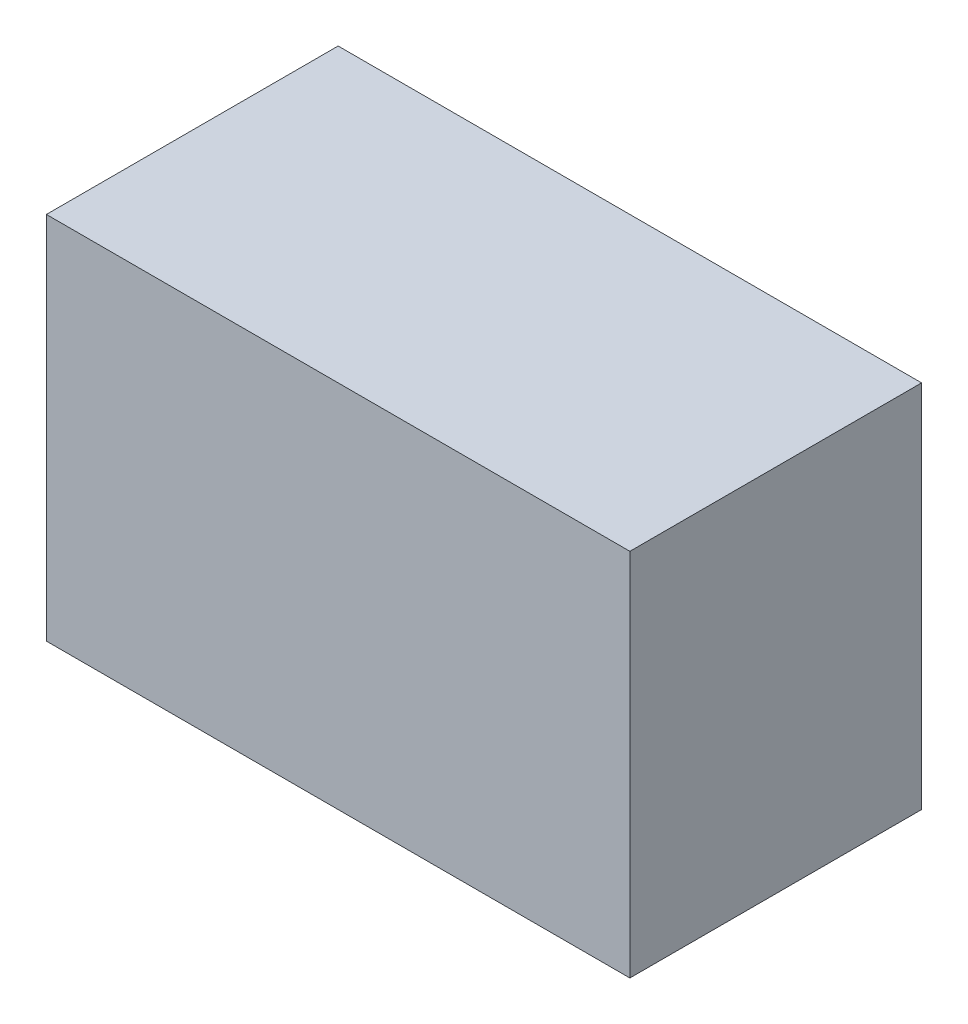
ISO-10303-21;
HEADER;
FILE_DESCRIPTION(('STEP AP214'),'2;1');
FILE_NAME('part.step','',(''),(''),'','','');
FILE_SCHEMA(('AUTOMOTIVE_DESIGN { 1 0 10303 214 1 1 1 1 }'));
ENDSEC;
DATA;
#1=APPLICATION_CONTEXT('core data for automotive mechanical design processes');
#2=APPLICATION_PROTOCOL_DEFINITION('international standard','automotive_design',2000,#1);
#3=PRODUCT_CONTEXT('',#1,'mechanical');
#4=PRODUCT('Part','Part','',(#3));
#5=PRODUCT_RELATED_PRODUCT_CATEGORY('part','',(#4));
#6=PRODUCT_DEFINITION_FORMATION('','',#4);
#7=PRODUCT_DEFINITION_CONTEXT('part definition',#1,'design');
#8=PRODUCT_DEFINITION('design','',#6,#7);
#9=PRODUCT_DEFINITION_SHAPE('','',#8);
#10=(LENGTH_UNIT() NAMED_UNIT(*) SI_UNIT(.MILLI.,.METRE.));
#11=(NAMED_UNIT(*) PLANE_ANGLE_UNIT() SI_UNIT($,.RADIAN.));
#12=(NAMED_UNIT(*) SI_UNIT($,.STERADIAN.) SOLID_ANGLE_UNIT());
#13=UNCERTAINTY_MEASURE_WITH_UNIT(LENGTH_MEASURE(1.E-05),#10,'distance_accuracy_value','');
#14=(GEOMETRIC_REPRESENTATION_CONTEXT(3) GLOBAL_UNCERTAINTY_ASSIGNED_CONTEXT((#13)) GLOBAL_UNIT_ASSIGNED_CONTEXT((#10,
#11,#12)) REPRESENTATION_CONTEXT('',''));
#15=CARTESIAN_POINT('',(0.,0.,0.));
#16=DIRECTION('',(0.,0.,1.));
#17=DIRECTION('',(1.,0.,0.));
#18=AXIS2_PLACEMENT_3D('',#15,#16,#17);
#19=CARTESIAN_POINT('',(0.,0.,15.));
#20=DIRECTION('',(1.,0.,0.));
#21=DIRECTION('',(0.,0.,-1.));
#22=AXIS2_PLACEMENT_3D('',#19,#20,#21);
#23=PLANE('',#22);
#24=DIRECTION('',(0.,-1.,0.));
#25=VECTOR('',#24,1.);
#26=CARTESIAN_POINT('',(0.,0.,0.));
#27=LINE('',#26,#25);
#28=CARTESIAN_POINT('',(0.,19.,0.));
#29=VERTEX_POINT('',#28);
#30=CARTESIAN_POINT('',(0.,0.,0.));
#31=VERTEX_POINT('',#30);
#32=EDGE_CURVE('E77',#29,#31,#27,.T.);
#33=ORIENTED_EDGE('',*,*,#32,.T.);
#34=DIRECTION('',(0.,0.,-1.));
#35=VECTOR('',#34,1.);
#36=CARTESIAN_POINT('',(0.,0.,15.));
#37=LINE('',#36,#35);
#38=CARTESIAN_POINT('',(0.,0.,15.));
#39=VERTEX_POINT('',#38);
#40=EDGE_CURVE('E11',#39,#31,#37,.T.);
#41=ORIENTED_EDGE('',*,*,#40,.F.);
#42=DIRECTION('',(0.,-1.,0.));
#43=VECTOR('',#42,1.);
#44=CARTESIAN_POINT('',(0.,0.,15.));
#45=LINE('',#44,#43);
#46=CARTESIAN_POINT('',(0.,19.,15.));
#47=VERTEX_POINT('',#46);
#48=EDGE_CURVE('E95',#47,#39,#45,.T.);
#49=ORIENTED_EDGE('',*,*,#48,.F.);
#50=DIRECTION('',(0.,0.,-1.));
#51=VECTOR('',#50,1.);
#52=CARTESIAN_POINT('',(0.,19.,15.));
#53=LINE('',#52,#51);
#54=EDGE_CURVE('E89',#47,#29,#53,.T.);
#55=ORIENTED_EDGE('',*,*,#54,.T.);
#56=EDGE_LOOP('',(#33,#41,#49,#55));
#57=FACE_BOUND('',#56,.T.);
#58=ADVANCED_FACE('F33',(#57),#23,.F.);
#59=CARTESIAN_POINT('',(0.,0.,15.));
#60=DIRECTION('',(0.,1.,0.));
#61=DIRECTION('',(0.,0.,1.));
#62=AXIS2_PLACEMENT_3D('',#59,#60,#61);
#63=PLANE('',#62);
#64=DIRECTION('',(1.,0.,0.));
#65=VECTOR('',#64,1.);
#66=CARTESIAN_POINT('',(0.,0.,0.));
#67=LINE('',#66,#65);
#68=CARTESIAN_POINT('',(30.,0.,0.));
#69=VERTEX_POINT('',#68);
#70=EDGE_CURVE('E73',#31,#69,#67,.T.);
#71=ORIENTED_EDGE('',*,*,#70,.T.);
#72=DIRECTION('',(0.,0.,-1.));
#73=VECTOR('',#72,1.);
#74=CARTESIAN_POINT('',(30.,0.,15.));
#75=LINE('',#74,#73);
#76=CARTESIAN_POINT('',(30.,0.,15.));
#77=VERTEX_POINT('',#76);
#78=EDGE_CURVE('E40',#77,#69,#75,.T.);
#79=ORIENTED_EDGE('',*,*,#78,.F.);
#80=DIRECTION('',(1.,0.,0.));
#81=VECTOR('',#80,1.);
#82=CARTESIAN_POINT('',(0.,0.,15.));
#83=LINE('',#82,#81);
#84=EDGE_CURVE('E85',#39,#77,#83,.T.);
#85=ORIENTED_EDGE('',*,*,#84,.F.);
#86=ORIENTED_EDGE('',*,*,#40,.T.);
#87=EDGE_LOOP('',(#71,#79,#85,#86));
#88=FACE_BOUND('',#87,.T.);
#89=ADVANCED_FACE('F84',(#88),#63,.F.);
#90=CARTESIAN_POINT('',(30.,0.,15.));
#91=DIRECTION('',(-1.,0.,0.));
#92=DIRECTION('',(0.,0.,1.));
#93=AXIS2_PLACEMENT_3D('',#90,#91,#92);
#94=PLANE('',#93);
#95=DIRECTION('',(0.,1.,0.));
#96=VECTOR('',#95,1.);
#97=CARTESIAN_POINT('',(30.,0.,0.));
#98=LINE('',#97,#96);
#99=CARTESIAN_POINT('',(30.,19.,0.));
#100=VERTEX_POINT('',#99);
#101=EDGE_CURVE('E78',#69,#100,#98,.T.);
#102=ORIENTED_EDGE('',*,*,#101,.T.);
#103=DIRECTION('',(0.,0.,-1.));
#104=VECTOR('',#103,1.);
#105=CARTESIAN_POINT('',(30.,19.,15.));
#106=LINE('',#105,#104);
#107=CARTESIAN_POINT('',(30.,19.,15.));
#108=VERTEX_POINT('',#107);
#109=EDGE_CURVE('E101',#108,#100,#106,.T.);
#110=ORIENTED_EDGE('',*,*,#109,.F.);
#111=DIRECTION('',(0.,1.,0.));
#112=VECTOR('',#111,1.);
#113=CARTESIAN_POINT('',(30.,0.,15.));
#114=LINE('',#113,#112);
#115=EDGE_CURVE('E52',#77,#108,#114,.T.);
#116=ORIENTED_EDGE('',*,*,#115,.F.);
#117=ORIENTED_EDGE('',*,*,#78,.T.);
#118=EDGE_LOOP('',(#102,#110,#116,#117));
#119=FACE_BOUND('',#118,.T.);
#120=ADVANCED_FACE('F104',(#119),#94,.F.);
#121=CARTESIAN_POINT('',(0.,19.,15.));
#122=DIRECTION('',(0.,-1.,0.));
#123=DIRECTION('',(0.,0.,-1.));
#124=AXIS2_PLACEMENT_3D('',#121,#122,#123);
#125=PLANE('',#124);
#126=DIRECTION('',(-1.,0.,0.));
#127=VECTOR('',#126,1.);
#128=CARTESIAN_POINT('',(0.,19.,0.));
#129=LINE('',#128,#127);
#130=EDGE_CURVE('E93',#100,#29,#129,.T.);
#131=ORIENTED_EDGE('',*,*,#130,.T.);
#132=ORIENTED_EDGE('',*,*,#54,.F.);
#133=DIRECTION('',(-1.,0.,0.));
#134=VECTOR('',#133,1.);
#135=CARTESIAN_POINT('',(0.,19.,15.));
#136=LINE('',#135,#134);
#137=EDGE_CURVE('E47',#108,#47,#136,.T.);
#138=ORIENTED_EDGE('',*,*,#137,.F.);
#139=ORIENTED_EDGE('',*,*,#109,.T.);
#140=EDGE_LOOP('',(#131,#132,#138,#139));
#141=FACE_BOUND('',#140,.T.);
#142=ADVANCED_FACE('F106',(#141),#125,.F.);
#143=CARTESIAN_POINT('',(0.,19.,15.));
#144=DIRECTION('',(0.,0.,-1.));
#145=DIRECTION('',(-1.,0.,0.));
#146=AXIS2_PLACEMENT_3D('',#143,#144,#145);
#147=PLANE('',#146);
#148=ORIENTED_EDGE('',*,*,#48,.T.);
#149=ORIENTED_EDGE('',*,*,#84,.T.);
#150=ORIENTED_EDGE('',*,*,#115,.T.);
#151=ORIENTED_EDGE('',*,*,#137,.T.);
#152=EDGE_LOOP('',(#148,#149,#150,#151));
#153=FACE_BOUND('',#152,.T.);
#154=ADVANCED_FACE('F107',(#153),#147,.F.);
#155=CARTESIAN_POINT('',(0.,19.,0.));
#156=DIRECTION('',(0.,0.,-1.));
#157=DIRECTION('',(-1.,0.,0.));
#158=AXIS2_PLACEMENT_3D('',#155,#156,#157);
#159=PLANE('',#158);
#160=ORIENTED_EDGE('',*,*,#32,.F.);
#161=ORIENTED_EDGE('',*,*,#130,.F.);
#162=ORIENTED_EDGE('',*,*,#101,.F.);
#163=ORIENTED_EDGE('',*,*,#70,.F.);
#164=EDGE_LOOP('',(#160,#161,#162,#163));
#165=FACE_BOUND('',#164,.T.);
#166=ADVANCED_FACE('F74',(#165),#159,.T.);
#167=CLOSED_SHELL('',(#58,#89,#120,#142,#154,#166));
#168=MANIFOLD_SOLID_BREP('B2',#167);
#169=ADVANCED_BREP_SHAPE_REPRESENTATION('',(#18,#168),#14);
#170=SHAPE_DEFINITION_REPRESENTATION(#9,#169);
ENDSEC;
END-ISO-10303-21;
